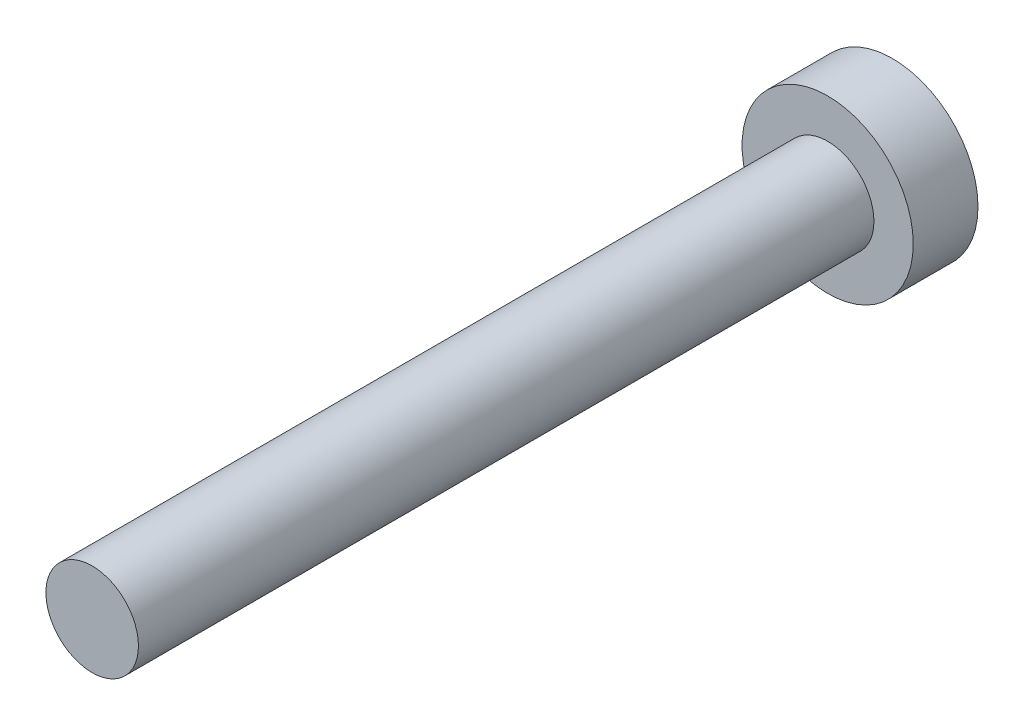
ISO-10303-21;
HEADER;
FILE_DESCRIPTION(('STEP AP214'),'2;1');
FILE_NAME('part.step','',(''),(''),'','','');
FILE_SCHEMA(('AUTOMOTIVE_DESIGN { 1 0 10303 214 1 1 1 1 }'));
ENDSEC;
DATA;
#1=APPLICATION_CONTEXT('core data for automotive mechanical design processes');
#2=APPLICATION_PROTOCOL_DEFINITION('international standard','automotive_design',2000,#1);
#3=PRODUCT_CONTEXT('',#1,'mechanical');
#4=PRODUCT('Part','Part','',(#3));
#5=PRODUCT_RELATED_PRODUCT_CATEGORY('part','',(#4));
#6=PRODUCT_DEFINITION_FORMATION('','',#4);
#7=PRODUCT_DEFINITION_CONTEXT('part definition',#1,'design');
#8=PRODUCT_DEFINITION('design','',#6,#7);
#9=PRODUCT_DEFINITION_SHAPE('','',#8);
#10=(LENGTH_UNIT() NAMED_UNIT(*) SI_UNIT(.MILLI.,.METRE.));
#11=(NAMED_UNIT(*) PLANE_ANGLE_UNIT() SI_UNIT($,.RADIAN.));
#12=(NAMED_UNIT(*) SI_UNIT($,.STERADIAN.) SOLID_ANGLE_UNIT());
#13=UNCERTAINTY_MEASURE_WITH_UNIT(LENGTH_MEASURE(1.E-05),#10,'distance_accuracy_value','');
#14=(GEOMETRIC_REPRESENTATION_CONTEXT(3) GLOBAL_UNCERTAINTY_ASSIGNED_CONTEXT((#13)) GLOBAL_UNIT_ASSIGNED_CONTEXT((#10,
#11,#12)) REPRESENTATION_CONTEXT('',''));
#15=CARTESIAN_POINT('',(0.,0.,0.));
#16=DIRECTION('',(0.,0.,1.));
#17=DIRECTION('',(1.,0.,0.));
#18=AXIS2_PLACEMENT_3D('',#15,#16,#17);
#19=CARTESIAN_POINT('',(0.,0.,1.4));
#20=DIRECTION('',(0.,0.,-1.));
#21=DIRECTION('',(-1.,0.,0.));
#22=AXIS2_PLACEMENT_3D('',#19,#20,#21);
#23=CYLINDRICAL_SURFACE('',#22,1.85);
#24=CARTESIAN_POINT('',(0.,0.,1.4));
#25=DIRECTION('',(0.,0.,1.));
#26=DIRECTION('',(1.,0.,0.));
#27=AXIS2_PLACEMENT_3D('',#24,#25,#26);
#28=CIRCLE('',#27,1.85);
#29=CARTESIAN_POINT('',(1.85,0.,1.4));
#30=VERTEX_POINT('',#29);
#31=EDGE_CURVE('E42',#30,#30,#28,.T.);
#32=ORIENTED_EDGE('',*,*,#31,.F.);
#33=EDGE_LOOP('',(#32));
#34=FACE_BOUND('',#33,.T.);
#35=CARTESIAN_POINT('',(0.,0.,0.));
#36=DIRECTION('',(0.,0.,1.));
#37=DIRECTION('',(1.,0.,0.));
#38=AXIS2_PLACEMENT_3D('',#35,#36,#37);
#39=CIRCLE('',#38,1.85);
#40=CARTESIAN_POINT('',(1.85,0.,0.));
#41=VERTEX_POINT('',#40);
#42=EDGE_CURVE('E38',#41,#41,#39,.T.);
#43=ORIENTED_EDGE('',*,*,#42,.T.);
#44=EDGE_LOOP('',(#43));
#45=FACE_BOUND('',#44,.T.);
#46=ADVANCED_FACE('F35',(#34,#45),#23,.T.);
#47=CARTESIAN_POINT('',(0.,0.,1.4));
#48=DIRECTION('',(0.,0.,1.));
#49=DIRECTION('',(1.,0.,0.));
#50=AXIS2_PLACEMENT_3D('',#47,#48,#49);
#51=PLANE('',#50);
#52=CARTESIAN_POINT('',(0.,0.,1.4));
#53=DIRECTION('',(0.,0.,1.));
#54=DIRECTION('',(1.,0.,0.));
#55=AXIS2_PLACEMENT_3D('',#52,#53,#54);
#56=CIRCLE('',#55,1.);
#57=CARTESIAN_POINT('',(1.,0.,1.4));
#58=VERTEX_POINT('',#57);
#59=EDGE_CURVE('E11',#58,#58,#56,.T.);
#60=ORIENTED_EDGE('',*,*,#59,.F.);
#61=EDGE_LOOP('',(#60));
#62=FACE_BOUND('',#61,.T.);
#63=ORIENTED_EDGE('',*,*,#31,.T.);
#64=EDGE_LOOP('',(#63));
#65=FACE_BOUND('',#64,.T.);
#66=ADVANCED_FACE('F59',(#62,#65),#51,.T.);
#67=CARTESIAN_POINT('',(0.,0.,0.));
#68=DIRECTION('',(0.,0.,1.));
#69=DIRECTION('',(1.,0.,0.));
#70=AXIS2_PLACEMENT_3D('',#67,#68,#69);
#71=PLANE('',#70);
#72=ORIENTED_EDGE('',*,*,#42,.F.);
#73=EDGE_LOOP('',(#72));
#74=FACE_BOUND('',#73,.T.);
#75=ADVANCED_FACE('F56',(#74),#71,.F.);
#76=CARTESIAN_POINT('',(0.,0.,37.4284271247462));
#77=DIRECTION('',(0.,0.,-1.));
#78=DIRECTION('',(-1.,0.,0.));
#79=AXIS2_PLACEMENT_3D('',#76,#77,#78);
#80=CYLINDRICAL_SURFACE('',#79,1.);
#81=ORIENTED_EDGE('',*,*,#59,.T.);
#82=EDGE_LOOP('',(#81));
#83=FACE_BOUND('',#82,.T.);
#84=CARTESIAN_POINT('',(0.,0.,17.3));
#85=DIRECTION('',(0.,0.,1.));
#86=DIRECTION('',(1.,0.,0.));
#87=AXIS2_PLACEMENT_3D('',#84,#85,#86);
#88=CIRCLE('',#87,1.);
#89=CARTESIAN_POINT('',(1.,0.,17.3));
#90=VERTEX_POINT('',#89);
#91=EDGE_CURVE('E48',#90,#90,#88,.T.);
#92=ORIENTED_EDGE('',*,*,#91,.F.);
#93=EDGE_LOOP('',(#92));
#94=FACE_BOUND('',#93,.T.);
#95=ADVANCED_FACE('F58',(#83,#94),#80,.T.);
#96=CARTESIAN_POINT('',(0.,0.,17.3));
#97=DIRECTION('',(0.,0.,1.));
#98=DIRECTION('',(1.,0.,0.));
#99=AXIS2_PLACEMENT_3D('',#96,#97,#98);
#100=PLANE('',#99);
#101=ORIENTED_EDGE('',*,*,#91,.T.);
#102=EDGE_LOOP('',(#101));
#103=FACE_BOUND('',#102,.T.);
#104=ADVANCED_FACE('F64',(#103),#100,.T.);
#105=CLOSED_SHELL('',(#46,#66,#75,#95,#104));
#106=MANIFOLD_SOLID_BREP('B2',#105);
#107=ADVANCED_BREP_SHAPE_REPRESENTATION('',(#18,#106),#14);
#108=SHAPE_DEFINITION_REPRESENTATION(#9,#107);
ENDSEC;
END-ISO-10303-21;
